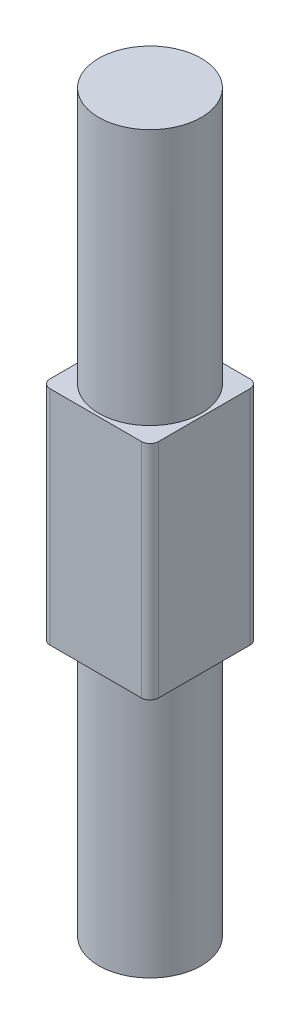
ISO-10303-21;
HEADER;
FILE_DESCRIPTION(('STEP AP214'),'2;1');
FILE_NAME('part.step','',(''),(''),'','','');
FILE_SCHEMA(('AUTOMOTIVE_DESIGN { 1 0 10303 214 1 1 1 1 }'));
ENDSEC;
DATA;
#1=APPLICATION_CONTEXT('core data for automotive mechanical design processes');
#2=APPLICATION_PROTOCOL_DEFINITION('international standard','automotive_design',2000,#1);
#3=PRODUCT_CONTEXT('',#1,'mechanical');
#4=PRODUCT('Part','Part','',(#3));
#5=PRODUCT_RELATED_PRODUCT_CATEGORY('part','',(#4));
#6=PRODUCT_DEFINITION_FORMATION('','',#4);
#7=PRODUCT_DEFINITION_CONTEXT('part definition',#1,'design');
#8=PRODUCT_DEFINITION('design','',#6,#7);
#9=PRODUCT_DEFINITION_SHAPE('','',#8);
#10=(LENGTH_UNIT() NAMED_UNIT(*) SI_UNIT(.MILLI.,.METRE.));
#11=(NAMED_UNIT(*) PLANE_ANGLE_UNIT() SI_UNIT($,.RADIAN.));
#12=(NAMED_UNIT(*) SI_UNIT($,.STERADIAN.) SOLID_ANGLE_UNIT());
#13=UNCERTAINTY_MEASURE_WITH_UNIT(LENGTH_MEASURE(1.E-05),#10,'distance_accuracy_value','');
#14=(GEOMETRIC_REPRESENTATION_CONTEXT(3) GLOBAL_UNCERTAINTY_ASSIGNED_CONTEXT((#13)) GLOBAL_UNIT_ASSIGNED_CONTEXT((#10,
#11,#12)) REPRESENTATION_CONTEXT('',''));
#15=CARTESIAN_POINT('',(0.,0.,0.));
#16=DIRECTION('',(0.,0.,1.));
#17=DIRECTION('',(1.,0.,0.));
#18=AXIS2_PLACEMENT_3D('',#15,#16,#17);
#19=CARTESIAN_POINT('',(0.,13.,0.));
#20=DIRECTION('',(1.,0.,0.));
#21=DIRECTION('',(0.,0.,-1.));
#22=AXIS2_PLACEMENT_3D('',#19,#20,#21);
#23=PLANE('',#22);
#24=DIRECTION('',(0.,0.,1.));
#25=VECTOR('',#24,1.);
#26=CARTESIAN_POINT('',(0.,0.,0.));
#27=LINE('',#26,#25);
#28=CARTESIAN_POINT('',(0.,0.,-5.85));
#29=VERTEX_POINT('',#28);
#30=CARTESIAN_POINT('',(0.,0.,-0.5));
#31=VERTEX_POINT('',#30);
#32=EDGE_CURVE('E125',#29,#31,#27,.T.);
#33=ORIENTED_EDGE('',*,*,#32,.T.);
#34=DIRECTION('',(0.,-1.,0.));
#35=VECTOR('',#34,1.);
#36=CARTESIAN_POINT('',(0.,13.,-0.5));
#37=LINE('',#36,#35);
#38=CARTESIAN_POINT('',(0.,13.,-0.5));
#39=VERTEX_POINT('',#38);
#40=EDGE_CURVE('E103',#31,#39,#37,.F.);
#41=ORIENTED_EDGE('',*,*,#40,.T.);
#42=DIRECTION('',(0.,0.,1.));
#43=VECTOR('',#42,1.);
#44=CARTESIAN_POINT('',(0.,13.,0.));
#45=LINE('',#44,#43);
#46=CARTESIAN_POINT('',(0.,13.,-5.85));
#47=VERTEX_POINT('',#46);
#48=EDGE_CURVE('E135',#47,#39,#45,.T.);
#49=ORIENTED_EDGE('',*,*,#48,.F.);
#50=DIRECTION('',(0.,-1.,0.));
#51=VECTOR('',#50,1.);
#52=CARTESIAN_POINT('',(0.,13.,-5.85));
#53=LINE('',#52,#51);
#54=EDGE_CURVE('E108',#47,#29,#53,.T.);
#55=ORIENTED_EDGE('',*,*,#54,.T.);
#56=EDGE_LOOP('',(#33,#41,#49,#55));
#57=FACE_BOUND('',#56,.T.);
#58=ADVANCED_FACE('F33',(#57),#23,.F.);
#59=CARTESIAN_POINT('',(0.,13.,0.));
#60=DIRECTION('',(0.,0.,-1.));
#61=DIRECTION('',(-1.,0.,0.));
#62=AXIS2_PLACEMENT_3D('',#59,#60,#61);
#63=PLANE('',#62);
#64=DIRECTION('',(1.,0.,0.));
#65=VECTOR('',#64,1.);
#66=CARTESIAN_POINT('',(0.,13.,0.));
#67=LINE('',#66,#65);
#68=CARTESIAN_POINT('',(0.5,13.,0.));
#69=VERTEX_POINT('',#68);
#70=CARTESIAN_POINT('',(5.85000000000001,13.,0.));
#71=VERTEX_POINT('',#70);
#72=EDGE_CURVE('E118',#69,#71,#67,.T.);
#73=ORIENTED_EDGE('',*,*,#72,.F.);
#74=DIRECTION('',(0.,-1.,0.));
#75=VECTOR('',#74,1.);
#76=CARTESIAN_POINT('',(0.5,13.,0.));
#77=LINE('',#76,#75);
#78=CARTESIAN_POINT('',(0.5,0.,0.));
#79=VERTEX_POINT('',#78);
#80=EDGE_CURVE('E102',#69,#79,#77,.T.);
#81=ORIENTED_EDGE('',*,*,#80,.T.);
#82=DIRECTION('',(1.,0.,0.));
#83=VECTOR('',#82,1.);
#84=CARTESIAN_POINT('',(0.,0.,0.));
#85=LINE('',#84,#83);
#86=CARTESIAN_POINT('',(5.85000000000001,0.,0.));
#87=VERTEX_POINT('',#86);
#88=EDGE_CURVE('E115',#79,#87,#85,.T.);
#89=ORIENTED_EDGE('',*,*,#88,.T.);
#90=DIRECTION('',(0.,-1.,0.));
#91=VECTOR('',#90,1.);
#92=CARTESIAN_POINT('',(5.85000000000001,13.,0.));
#93=LINE('',#92,#91);
#94=EDGE_CURVE('E120',#87,#71,#93,.F.);
#95=ORIENTED_EDGE('',*,*,#94,.T.);
#96=EDGE_LOOP('',(#73,#81,#89,#95));
#97=FACE_BOUND('',#96,.T.);
#98=ADVANCED_FACE('F114',(#97),#63,.F.);
#99=CARTESIAN_POINT('',(6.35000000000001,13.,0.));
#100=DIRECTION('',(-1.,0.,0.));
#101=DIRECTION('',(0.,0.,1.));
#102=AXIS2_PLACEMENT_3D('',#99,#100,#101);
#103=PLANE('',#102);
#104=DIRECTION('',(0.,0.,-1.));
#105=VECTOR('',#104,1.);
#106=CARTESIAN_POINT('',(6.35000000000001,13.,0.));
#107=LINE('',#106,#105);
#108=CARTESIAN_POINT('',(6.35000000000001,13.,-0.500000000000001));
#109=VERTEX_POINT('',#108);
#110=CARTESIAN_POINT('',(6.35,13.,-5.85));
#111=VERTEX_POINT('',#110);
#112=EDGE_CURVE('E172',#109,#111,#107,.T.);
#113=ORIENTED_EDGE('',*,*,#112,.F.);
#114=DIRECTION('',(0.,-1.,0.));
#115=VECTOR('',#114,1.);
#116=CARTESIAN_POINT('',(6.35000000000001,13.,-0.500000000000001));
#117=LINE('',#116,#115);
#118=CARTESIAN_POINT('',(6.35000000000001,0.,-0.500000000000001));
#119=VERTEX_POINT('',#118);
#120=EDGE_CURVE('E157',#109,#119,#117,.T.);
#121=ORIENTED_EDGE('',*,*,#120,.T.);
#122=DIRECTION('',(0.,0.,-1.));
#123=VECTOR('',#122,1.);
#124=CARTESIAN_POINT('',(6.35000000000001,0.,0.));
#125=LINE('',#124,#123);
#126=CARTESIAN_POINT('',(6.35,0.,-5.85));
#127=VERTEX_POINT('',#126);
#128=EDGE_CURVE('E124',#119,#127,#125,.T.);
#129=ORIENTED_EDGE('',*,*,#128,.T.);
#130=DIRECTION('',(0.,-1.,0.));
#131=VECTOR('',#130,1.);
#132=CARTESIAN_POINT('',(6.35,13.,-5.85));
#133=LINE('',#132,#131);
#134=EDGE_CURVE('E155',#127,#111,#133,.F.);
#135=ORIENTED_EDGE('',*,*,#134,.T.);
#136=EDGE_LOOP('',(#113,#121,#129,#135));
#137=FACE_BOUND('',#136,.T.);
#138=ADVANCED_FACE('F188',(#137),#103,.F.);
#139=CARTESIAN_POINT('',(0.,13.,-6.35));
#140=DIRECTION('',(0.,0.,1.));
#141=DIRECTION('',(1.,0.,0.));
#142=AXIS2_PLACEMENT_3D('',#139,#140,#141);
#143=PLANE('',#142);
#144=DIRECTION('',(-1.,0.,0.));
#145=VECTOR('',#144,1.);
#146=CARTESIAN_POINT('',(0.,0.,-6.35));
#147=LINE('',#146,#145);
#148=CARTESIAN_POINT('',(5.85,0.,-6.35));
#149=VERTEX_POINT('',#148);
#150=CARTESIAN_POINT('',(0.5,0.,-6.35));
#151=VERTEX_POINT('',#150);
#152=EDGE_CURVE('E128',#149,#151,#147,.T.);
#153=ORIENTED_EDGE('',*,*,#152,.T.);
#154=DIRECTION('',(0.,-1.,0.));
#155=VECTOR('',#154,1.);
#156=CARTESIAN_POINT('',(0.5,13.,-6.35));
#157=LINE('',#156,#155);
#158=CARTESIAN_POINT('',(0.5,13.,-6.35));
#159=VERTEX_POINT('',#158);
#160=EDGE_CURVE('E11',#151,#159,#157,.F.);
#161=ORIENTED_EDGE('',*,*,#160,.T.);
#162=DIRECTION('',(-1.,0.,0.));
#163=VECTOR('',#162,1.);
#164=CARTESIAN_POINT('',(0.,13.,-6.35));
#165=LINE('',#164,#163);
#166=CARTESIAN_POINT('',(5.85,13.,-6.35));
#167=VERTEX_POINT('',#166);
#168=EDGE_CURVE('E139',#167,#159,#165,.T.);
#169=ORIENTED_EDGE('',*,*,#168,.F.);
#170=DIRECTION('',(0.,-1.,0.));
#171=VECTOR('',#170,1.);
#172=CARTESIAN_POINT('',(5.85,13.,-6.35));
#173=LINE('',#172,#171);
#174=EDGE_CURVE('E41',#167,#149,#173,.T.);
#175=ORIENTED_EDGE('',*,*,#174,.T.);
#176=EDGE_LOOP('',(#153,#161,#169,#175));
#177=FACE_BOUND('',#176,.T.);
#178=ADVANCED_FACE('F162',(#177),#143,.F.);
#179=CARTESIAN_POINT('',(0.,13.,0.));
#180=DIRECTION('',(0.,-1.,0.));
#181=DIRECTION('',(0.,0.,-1.));
#182=AXIS2_PLACEMENT_3D('',#179,#180,#181);
#183=PLANE('',#182);
#184=CARTESIAN_POINT('',(3.175,13.,-3.175));
#185=DIRECTION('',(0.,-1.,0.));
#186=DIRECTION('',(0.,0.,-1.));
#187=AXIS2_PLACEMENT_3D('',#184,#185,#186);
#188=CIRCLE('',#187,3.);
#189=CARTESIAN_POINT('',(3.175,13.,-6.175));
#190=VERTEX_POINT('',#189);
#191=EDGE_CURVE('E130',#190,#190,#188,.T.);
#192=ORIENTED_EDGE('',*,*,#191,.T.);
#193=EDGE_LOOP('',(#192));
#194=FACE_BOUND('',#193,.T.);
#195=ORIENTED_EDGE('',*,*,#48,.T.);
#196=CARTESIAN_POINT('',(0.5,13.,-0.5));
#197=DIRECTION('',(0.,-1.,0.));
#198=DIRECTION('',(0.,0.,-1.));
#199=AXIS2_PLACEMENT_3D('',#196,#197,#198);
#200=CIRCLE('',#199,0.5);
#201=EDGE_CURVE('E153',#39,#69,#200,.F.);
#202=ORIENTED_EDGE('',*,*,#201,.T.);
#203=ORIENTED_EDGE('',*,*,#72,.T.);
#204=CARTESIAN_POINT('',(5.85000000000001,13.,-0.5));
#205=DIRECTION('',(0.,-1.,0.));
#206=DIRECTION('',(0.,0.,-1.));
#207=AXIS2_PLACEMENT_3D('',#204,#205,#206);
#208=CIRCLE('',#207,0.5);
#209=EDGE_CURVE('E151',#71,#109,#208,.F.);
#210=ORIENTED_EDGE('',*,*,#209,.T.);
#211=ORIENTED_EDGE('',*,*,#112,.T.);
#212=CARTESIAN_POINT('',(5.85,13.,-5.85));
#213=DIRECTION('',(0.,-1.,0.));
#214=DIRECTION('',(0.,0.,-1.));
#215=AXIS2_PLACEMENT_3D('',#212,#213,#214);
#216=CIRCLE('',#215,0.5);
#217=EDGE_CURVE('E53',#111,#167,#216,.F.);
#218=ORIENTED_EDGE('',*,*,#217,.T.);
#219=ORIENTED_EDGE('',*,*,#168,.T.);
#220=CARTESIAN_POINT('',(0.5,13.,-5.85));
#221=DIRECTION('',(0.,-1.,0.));
#222=DIRECTION('',(0.,0.,-1.));
#223=AXIS2_PLACEMENT_3D('',#220,#221,#222);
#224=CIRCLE('',#223,0.5);
#225=EDGE_CURVE('E149',#159,#47,#224,.F.);
#226=ORIENTED_EDGE('',*,*,#225,.T.);
#227=EDGE_LOOP('',(#195,#202,#203,#210,#211,#218,#219,#226));
#228=FACE_BOUND('',#227,.T.);
#229=ADVANCED_FACE('F177',(#194,#228),#183,.F.);
#230=CARTESIAN_POINT('',(0.,0.,0.));
#231=DIRECTION('',(0.,-1.,0.));
#232=DIRECTION('',(0.,0.,-1.));
#233=AXIS2_PLACEMENT_3D('',#230,#231,#232);
#234=PLANE('',#233);
#235=CARTESIAN_POINT('',(3.175,0.,-3.175));
#236=DIRECTION('',(0.,-1.,0.));
#237=DIRECTION('',(0.,0.,-1.));
#238=AXIS2_PLACEMENT_3D('',#235,#236,#237);
#239=CIRCLE('',#238,3.);
#240=CARTESIAN_POINT('',(3.175,0.,-6.175));
#241=VERTEX_POINT('',#240);
#242=EDGE_CURVE('E136',#241,#241,#239,.T.);
#243=ORIENTED_EDGE('',*,*,#242,.F.);
#244=EDGE_LOOP('',(#243));
#245=FACE_BOUND('',#244,.T.);
#246=ORIENTED_EDGE('',*,*,#88,.F.);
#247=CARTESIAN_POINT('',(0.5,0.,-0.5));
#248=DIRECTION('',(0.,-1.,0.));
#249=DIRECTION('',(0.,0.,-1.));
#250=AXIS2_PLACEMENT_3D('',#247,#248,#249);
#251=CIRCLE('',#250,0.5);
#252=EDGE_CURVE('E98',#79,#31,#251,.T.);
#253=ORIENTED_EDGE('',*,*,#252,.T.);
#254=ORIENTED_EDGE('',*,*,#32,.F.);
#255=CARTESIAN_POINT('',(0.5,0.,-5.85));
#256=DIRECTION('',(0.,-1.,0.));
#257=DIRECTION('',(0.,0.,-1.));
#258=AXIS2_PLACEMENT_3D('',#255,#256,#257);
#259=CIRCLE('',#258,0.5);
#260=EDGE_CURVE('E142',#29,#151,#259,.T.);
#261=ORIENTED_EDGE('',*,*,#260,.T.);
#262=ORIENTED_EDGE('',*,*,#152,.F.);
#263=CARTESIAN_POINT('',(5.85,0.,-5.85));
#264=DIRECTION('',(0.,-1.,0.));
#265=DIRECTION('',(0.,0.,-1.));
#266=AXIS2_PLACEMENT_3D('',#263,#264,#265);
#267=CIRCLE('',#266,0.5);
#268=EDGE_CURVE('E119',#149,#127,#267,.T.);
#269=ORIENTED_EDGE('',*,*,#268,.T.);
#270=ORIENTED_EDGE('',*,*,#128,.F.);
#271=CARTESIAN_POINT('',(5.85000000000001,0.,-0.5));
#272=DIRECTION('',(0.,-1.,0.));
#273=DIRECTION('',(0.,0.,-1.));
#274=AXIS2_PLACEMENT_3D('',#271,#272,#273);
#275=CIRCLE('',#274,0.5);
#276=EDGE_CURVE('E109',#119,#87,#275,.T.);
#277=ORIENTED_EDGE('',*,*,#276,.T.);
#278=EDGE_LOOP('',(#246,#253,#254,#261,#262,#269,#270,#277));
#279=FACE_BOUND('',#278,.T.);
#280=ADVANCED_FACE('F122',(#245,#279),#234,.T.);
#281=CARTESIAN_POINT('',(3.175,-15.,-3.175));
#282=DIRECTION('',(0.,1.,0.));
#283=DIRECTION('',(0.,0.,1.));
#284=AXIS2_PLACEMENT_3D('',#281,#282,#283);
#285=PLANE('',#284);
#286=CARTESIAN_POINT('',(3.175,-15.,-3.175));
#287=DIRECTION('',(0.,1.,0.));
#288=DIRECTION('',(0.,0.,1.));
#289=AXIS2_PLACEMENT_3D('',#286,#287,#288);
#290=CIRCLE('',#289,3.);
#291=CARTESIAN_POINT('',(3.175,-15.,-0.175000000000001));
#292=VERTEX_POINT('',#291);
#293=EDGE_CURVE('E298',#292,#292,#290,.T.);
#294=ORIENTED_EDGE('',*,*,#293,.F.);
#295=EDGE_LOOP('',(#294));
#296=FACE_BOUND('',#295,.T.);
#297=ADVANCED_FACE('F185',(#296),#285,.F.);
#298=CARTESIAN_POINT('',(3.175,-15.,-3.175));
#299=DIRECTION('',(0.,1.,0.));
#300=DIRECTION('',(0.,0.,1.));
#301=AXIS2_PLACEMENT_3D('',#298,#299,#300);
#302=CYLINDRICAL_SURFACE('',#301,3.);
#303=ORIENTED_EDGE('',*,*,#242,.T.);
#304=EDGE_LOOP('',(#303));
#305=FACE_BOUND('',#304,.T.);
#306=ORIENTED_EDGE('',*,*,#293,.T.);
#307=EDGE_LOOP('',(#306));
#308=FACE_BOUND('',#307,.T.);
#309=ADVANCED_FACE('F274',(#305,#308),#302,.T.);
#310=CARTESIAN_POINT('',(3.175,28.,-3.175));
#311=DIRECTION('',(0.,1.,0.));
#312=DIRECTION('',(0.,0.,1.));
#313=AXIS2_PLACEMENT_3D('',#310,#311,#312);
#314=CIRCLE('',#313,3.);
#315=CARTESIAN_POINT('',(3.175,28.,-0.175000000000001));
#316=VERTEX_POINT('',#315);
#317=EDGE_CURVE('E300',#316,#316,#314,.T.);
#318=ORIENTED_EDGE('',*,*,#317,.F.);
#319=EDGE_LOOP('',(#318));
#320=FACE_BOUND('',#319,.T.);
#321=ORIENTED_EDGE('',*,*,#191,.F.);
#322=EDGE_LOOP('',(#321));
#323=FACE_BOUND('',#322,.T.);
#324=ADVANCED_FACE('F267',(#320,#323),#302,.T.);
#325=CARTESIAN_POINT('',(3.175,28.,-3.175));
#326=DIRECTION('',(0.,1.,0.));
#327=DIRECTION('',(0.,0.,1.));
#328=AXIS2_PLACEMENT_3D('',#325,#326,#327);
#329=PLANE('',#328);
#330=ORIENTED_EDGE('',*,*,#317,.T.);
#331=EDGE_LOOP('',(#330));
#332=FACE_BOUND('',#331,.T.);
#333=ADVANCED_FACE('F203',(#332),#329,.T.);
#334=CARTESIAN_POINT('',(0.5,13.,-0.5));
#335=DIRECTION('',(0.,-1.,0.));
#336=DIRECTION('',(0.,0.,-1.));
#337=AXIS2_PLACEMENT_3D('',#334,#335,#336);
#338=CYLINDRICAL_SURFACE('',#337,0.5);
#339=ORIENTED_EDGE('',*,*,#201,.F.);
#340=ORIENTED_EDGE('',*,*,#40,.F.);
#341=ORIENTED_EDGE('',*,*,#252,.F.);
#342=ORIENTED_EDGE('',*,*,#80,.F.);
#343=EDGE_LOOP('',(#339,#340,#341,#342));
#344=FACE_BOUND('',#343,.T.);
#345=ADVANCED_FACE('F101',(#344),#338,.T.);
#346=CARTESIAN_POINT('',(5.85000000000001,13.,-0.5));
#347=DIRECTION('',(0.,-1.,0.));
#348=DIRECTION('',(0.,0.,-1.));
#349=AXIS2_PLACEMENT_3D('',#346,#347,#348);
#350=CYLINDRICAL_SURFACE('',#349,0.5);
#351=ORIENTED_EDGE('',*,*,#209,.F.);
#352=ORIENTED_EDGE('',*,*,#94,.F.);
#353=ORIENTED_EDGE('',*,*,#276,.F.);
#354=ORIENTED_EDGE('',*,*,#120,.F.);
#355=EDGE_LOOP('',(#351,#352,#353,#354));
#356=FACE_BOUND('',#355,.T.);
#357=ADVANCED_FACE('F202',(#356),#350,.T.);
#358=CARTESIAN_POINT('',(0.5,13.,-5.85));
#359=DIRECTION('',(0.,-1.,0.));
#360=DIRECTION('',(0.,0.,-1.));
#361=AXIS2_PLACEMENT_3D('',#358,#359,#360);
#362=CYLINDRICAL_SURFACE('',#361,0.5);
#363=ORIENTED_EDGE('',*,*,#225,.F.);
#364=ORIENTED_EDGE('',*,*,#160,.F.);
#365=ORIENTED_EDGE('',*,*,#260,.F.);
#366=ORIENTED_EDGE('',*,*,#54,.F.);
#367=EDGE_LOOP('',(#363,#364,#365,#366));
#368=FACE_BOUND('',#367,.T.);
#369=ADVANCED_FACE('F167',(#368),#362,.T.);
#370=CARTESIAN_POINT('',(5.85,13.,-5.85));
#371=DIRECTION('',(0.,-1.,0.));
#372=DIRECTION('',(0.,0.,-1.));
#373=AXIS2_PLACEMENT_3D('',#370,#371,#372);
#374=CYLINDRICAL_SURFACE('',#373,0.5);
#375=ORIENTED_EDGE('',*,*,#217,.F.);
#376=ORIENTED_EDGE('',*,*,#134,.F.);
#377=ORIENTED_EDGE('',*,*,#268,.F.);
#378=ORIENTED_EDGE('',*,*,#174,.F.);
#379=EDGE_LOOP('',(#375,#376,#377,#378));
#380=FACE_BOUND('',#379,.T.);
#381=ADVANCED_FACE('F35',(#380),#374,.T.);
#382=CLOSED_SHELL('',(#58,#98,#138,#178,#229,#280,#297,#309,#324,#333,#345,#357,#369,#381));
#383=MANIFOLD_SOLID_BREP('B2',#382);
#384=ADVANCED_BREP_SHAPE_REPRESENTATION('',(#18,#383),#14);
#385=SHAPE_DEFINITION_REPRESENTATION(#9,#384);
ENDSEC;
END-ISO-10303-21;
